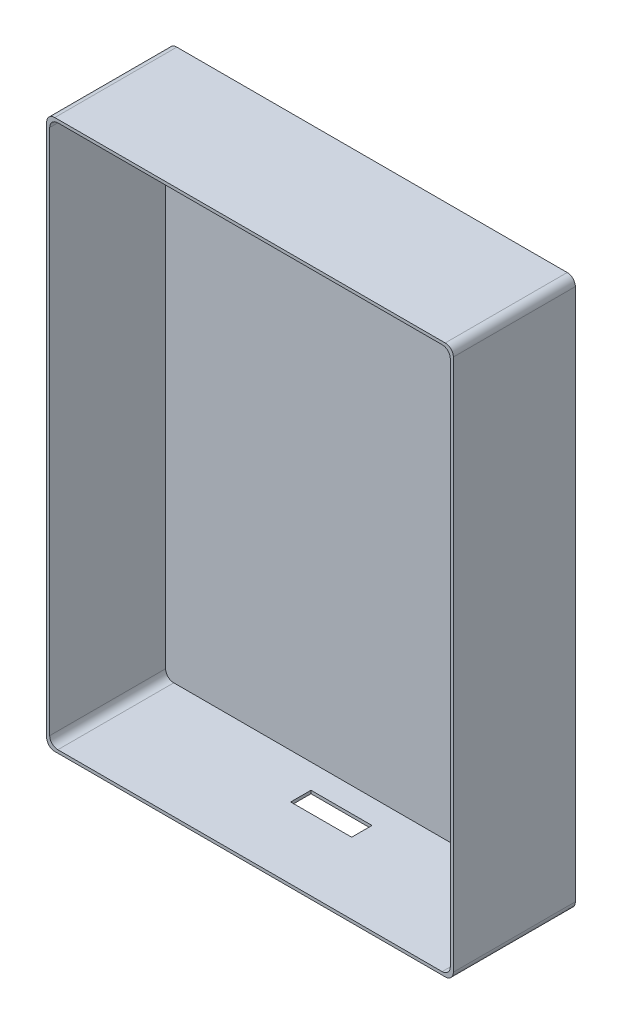
ISO-10303-21;
HEADER;
FILE_DESCRIPTION(('STEP AP214'),'2;1');
FILE_NAME('part.step','',(''),(''),'','','');
FILE_SCHEMA(('AUTOMOTIVE_DESIGN { 1 0 10303 214 1 1 1 1 }'));
ENDSEC;
DATA;
#1=APPLICATION_CONTEXT('core data for automotive mechanical design processes');
#2=APPLICATION_PROTOCOL_DEFINITION('international standard','automotive_design',2000,#1);
#3=PRODUCT_CONTEXT('',#1,'mechanical');
#4=PRODUCT('Part','Part','',(#3));
#5=PRODUCT_RELATED_PRODUCT_CATEGORY('part','',(#4));
#6=PRODUCT_DEFINITION_FORMATION('','',#4);
#7=PRODUCT_DEFINITION_CONTEXT('part definition',#1,'design');
#8=PRODUCT_DEFINITION('design','',#6,#7);
#9=PRODUCT_DEFINITION_SHAPE('','',#8);
#10=(LENGTH_UNIT() NAMED_UNIT(*) SI_UNIT(.MILLI.,.METRE.));
#11=(NAMED_UNIT(*) PLANE_ANGLE_UNIT() SI_UNIT($,.RADIAN.));
#12=(NAMED_UNIT(*) SI_UNIT($,.STERADIAN.) SOLID_ANGLE_UNIT());
#13=UNCERTAINTY_MEASURE_WITH_UNIT(LENGTH_MEASURE(1.E-05),#10,'distance_accuracy_value','');
#14=(GEOMETRIC_REPRESENTATION_CONTEXT(3) GLOBAL_UNCERTAINTY_ASSIGNED_CONTEXT((#13)) GLOBAL_UNIT_ASSIGNED_CONTEXT((#10,
#11,#12)) REPRESENTATION_CONTEXT('',''));
#15=CARTESIAN_POINT('',(0.,0.,0.));
#16=DIRECTION('',(0.,0.,1.));
#17=DIRECTION('',(1.,0.,0.));
#18=AXIS2_PLACEMENT_3D('',#15,#16,#17);
#19=CARTESIAN_POINT('',(-50.,-67.5,30.));
#20=DIRECTION('',(0.,1.,0.));
#21=DIRECTION('',(0.,0.,1.));
#22=AXIS2_PLACEMENT_3D('',#19,#20,#21);
#23=PLANE('',#22);
#24=DIRECTION('',(1.,0.,0.));
#25=VECTOR('',#24,1.);
#26=CARTESIAN_POINT('',(-50.,-67.5,30.));
#27=LINE('',#26,#25);
#28=CARTESIAN_POINT('',(-48.,-67.5,30.));
#29=VERTEX_POINT('',#28);
#30=CARTESIAN_POINT('',(48.,-67.5,30.));
#31=VERTEX_POINT('',#30);
#32=EDGE_CURVE('E229',#29,#31,#27,.T.);
#33=ORIENTED_EDGE('',*,*,#32,.F.);
#34=DIRECTION('',(0.,0.,-1.));
#35=VECTOR('',#34,1.);
#36=CARTESIAN_POINT('',(-48.,-67.5,30.));
#37=LINE('',#36,#35);
#38=CARTESIAN_POINT('',(-48.,-67.5,0.));
#39=VERTEX_POINT('',#38);
#40=EDGE_CURVE('E244',#29,#39,#37,.T.);
#41=ORIENTED_EDGE('',*,*,#40,.T.);
#42=DIRECTION('',(1.,0.,0.));
#43=VECTOR('',#42,1.);
#44=CARTESIAN_POINT('',(-50.,-67.5,0.));
#45=LINE('',#44,#43);
#46=CARTESIAN_POINT('',(48.,-67.5,0.));
#47=VERTEX_POINT('',#46);
#48=EDGE_CURVE('E223',#39,#47,#45,.T.);
#49=ORIENTED_EDGE('',*,*,#48,.T.);
#50=DIRECTION('',(0.,0.,-1.));
#51=VECTOR('',#50,1.);
#52=CARTESIAN_POINT('',(48.,-67.5,30.));
#53=LINE('',#52,#51);
#54=EDGE_CURVE('E232',#47,#31,#53,.F.);
#55=ORIENTED_EDGE('',*,*,#54,.T.);
#56=EDGE_LOOP('',(#33,#41,#49,#55));
#57=FACE_BOUND('',#56,.T.);
#58=DIRECTION('',(0.,0.,-1.));
#59=VECTOR('',#58,1.);
#60=CARTESIAN_POINT('',(7.5,-67.5,0.));
#61=LINE('',#60,#59);
#62=CARTESIAN_POINT('',(7.5,-67.5,12.5));
#63=VERTEX_POINT('',#62);
#64=CARTESIAN_POINT('',(7.5,-67.5,7.5));
#65=VERTEX_POINT('',#64);
#66=EDGE_CURVE('E47',#63,#65,#61,.T.);
#67=ORIENTED_EDGE('',*,*,#66,.T.);
#68=DIRECTION('',(1.,0.,0.));
#69=VECTOR('',#68,1.);
#70=CARTESIAN_POINT('',(0.,-67.5,7.5));
#71=LINE('',#70,#69);
#72=CARTESIAN_POINT('',(-7.49999999999999,-67.5,7.5));
#73=VERTEX_POINT('',#72);
#74=EDGE_CURVE('E185',#73,#65,#71,.T.);
#75=ORIENTED_EDGE('',*,*,#74,.F.);
#76=DIRECTION('',(0.,0.,-1.));
#77=VECTOR('',#76,1.);
#78=CARTESIAN_POINT('',(-7.49999999999999,-67.5,0.));
#79=LINE('',#78,#77);
#80=CARTESIAN_POINT('',(-7.5,-67.5,12.5));
#81=VERTEX_POINT('',#80);
#82=EDGE_CURVE('E171',#81,#73,#79,.T.);
#83=ORIENTED_EDGE('',*,*,#82,.F.);
#84=DIRECTION('',(1.,0.,0.));
#85=VECTOR('',#84,1.);
#86=CARTESIAN_POINT('',(0.,-67.5,12.5));
#87=LINE('',#86,#85);
#88=EDGE_CURVE('E180',#81,#63,#87,.T.);
#89=ORIENTED_EDGE('',*,*,#88,.T.);
#90=EDGE_LOOP('',(#67,#75,#83,#89));
#91=FACE_BOUND('',#90,.T.);
#92=ADVANCED_FACE('F32',(#57,#91),#23,.F.);
#93=CARTESIAN_POINT('',(0.,-66.75,1.5));
#94=DIRECTION('',(0.,-1.,0.));
#95=DIRECTION('',(0.,0.,-1.));
#96=AXIS2_PLACEMENT_3D('',#93,#94,#95);
#97=PLANE('',#96);
#98=DIRECTION('',(1.,0.,0.));
#99=VECTOR('',#98,1.);
#100=CARTESIAN_POINT('',(0.,-66.75,1.5));
#101=LINE('',#100,#99);
#102=CARTESIAN_POINT('',(-47.25,-66.75,1.5));
#103=VERTEX_POINT('',#102);
#104=CARTESIAN_POINT('',(47.25,-66.75,1.5));
#105=VERTEX_POINT('',#104);
#106=EDGE_CURVE('E205',#103,#105,#101,.T.);
#107=ORIENTED_EDGE('',*,*,#106,.F.);
#108=DIRECTION('',(0.,0.,1.));
#109=VECTOR('',#108,1.);
#110=CARTESIAN_POINT('',(-47.25,-66.75,30.));
#111=LINE('',#110,#109);
#112=CARTESIAN_POINT('',(-47.25,-66.75,30.));
#113=VERTEX_POINT('',#112);
#114=EDGE_CURVE('E298',#103,#113,#111,.T.);
#115=ORIENTED_EDGE('',*,*,#114,.T.);
#116=DIRECTION('',(1.,0.,0.));
#117=VECTOR('',#116,1.);
#118=CARTESIAN_POINT('',(0.,-66.75,30.));
#119=LINE('',#118,#117);
#120=CARTESIAN_POINT('',(47.25,-66.75,30.));
#121=VERTEX_POINT('',#120);
#122=EDGE_CURVE('E199',#113,#121,#119,.T.);
#123=ORIENTED_EDGE('',*,*,#122,.T.);
#124=DIRECTION('',(0.,0.,1.));
#125=VECTOR('',#124,1.);
#126=CARTESIAN_POINT('',(47.25,-66.75,1.5));
#127=LINE('',#126,#125);
#128=EDGE_CURVE('E296',#121,#105,#127,.F.);
#129=ORIENTED_EDGE('',*,*,#128,.T.);
#130=EDGE_LOOP('',(#107,#115,#123,#129));
#131=FACE_BOUND('',#130,.T.);
#132=DIRECTION('',(0.,0.,-1.));
#133=VECTOR('',#132,1.);
#134=CARTESIAN_POINT('',(7.5,-66.75,1.5));
#135=LINE('',#134,#133);
#136=CARTESIAN_POINT('',(7.5,-66.75,12.5));
#137=VERTEX_POINT('',#136);
#138=CARTESIAN_POINT('',(7.5,-66.75,7.5));
#139=VERTEX_POINT('',#138);
#140=EDGE_CURVE('E11',#137,#139,#135,.T.);
#141=ORIENTED_EDGE('',*,*,#140,.F.);
#142=DIRECTION('',(1.,0.,0.));
#143=VECTOR('',#142,1.);
#144=CARTESIAN_POINT('',(0.,-66.75,12.5));
#145=LINE('',#144,#143);
#146=CARTESIAN_POINT('',(-7.5,-66.75,12.5));
#147=VERTEX_POINT('',#146);
#148=EDGE_CURVE('E314',#147,#137,#145,.T.);
#149=ORIENTED_EDGE('',*,*,#148,.F.);
#150=DIRECTION('',(0.,0.,-1.));
#151=VECTOR('',#150,1.);
#152=CARTESIAN_POINT('',(-7.49999999999999,-66.75,1.5));
#153=LINE('',#152,#151);
#154=CARTESIAN_POINT('',(-7.49999999999999,-66.75,7.5));
#155=VERTEX_POINT('',#154);
#156=EDGE_CURVE('E174',#147,#155,#153,.T.);
#157=ORIENTED_EDGE('',*,*,#156,.T.);
#158=DIRECTION('',(1.,0.,0.));
#159=VECTOR('',#158,1.);
#160=CARTESIAN_POINT('',(0.,-66.75,7.5));
#161=LINE('',#160,#159);
#162=EDGE_CURVE('E40',#155,#139,#161,.T.);
#163=ORIENTED_EDGE('',*,*,#162,.T.);
#164=EDGE_LOOP('',(#141,#149,#157,#163));
#165=FACE_BOUND('',#164,.T.);
#166=ADVANCED_FACE('F319',(#131,#165),#97,.F.);
#167=CARTESIAN_POINT('',(0.,0.,30.));
#168=DIRECTION('',(0.,0.,1.));
#169=DIRECTION('',(1.,0.,0.));
#170=AXIS2_PLACEMENT_3D('',#167,#168,#169);
#171=PLANE('',#170);
#172=DIRECTION('',(0.,-1.,0.));
#173=VECTOR('',#172,1.);
#174=CARTESIAN_POINT('',(-50.,67.5,30.));
#175=LINE('',#174,#173);
#176=CARTESIAN_POINT('',(-50.,65.5,30.));
#177=VERTEX_POINT('',#176);
#178=CARTESIAN_POINT('',(-50.,-65.5,30.));
#179=VERTEX_POINT('',#178);
#180=EDGE_CURVE('E226',#177,#179,#175,.T.);
#181=ORIENTED_EDGE('',*,*,#180,.T.);
#182=CARTESIAN_POINT('',(-48.,-65.5,30.));
#183=DIRECTION('',(0.,0.,1.));
#184=DIRECTION('',(1.,0.,0.));
#185=AXIS2_PLACEMENT_3D('',#182,#183,#184);
#186=CIRCLE('',#185,2.);
#187=EDGE_CURVE('E266',#179,#29,#186,.T.);
#188=ORIENTED_EDGE('',*,*,#187,.T.);
#189=ORIENTED_EDGE('',*,*,#32,.T.);
#190=CARTESIAN_POINT('',(48.,-65.5,30.));
#191=DIRECTION('',(0.,0.,1.));
#192=DIRECTION('',(1.,0.,0.));
#193=AXIS2_PLACEMENT_3D('',#190,#191,#192);
#194=CIRCLE('',#193,2.);
#195=CARTESIAN_POINT('',(50.,-65.5,30.));
#196=VERTEX_POINT('',#195);
#197=EDGE_CURVE('E260',#31,#196,#194,.T.);
#198=ORIENTED_EDGE('',*,*,#197,.T.);
#199=DIRECTION('',(0.,1.,0.));
#200=VECTOR('',#199,1.);
#201=CARTESIAN_POINT('',(50.,67.5,30.));
#202=LINE('',#201,#200);
#203=CARTESIAN_POINT('',(50.,65.5,30.));
#204=VERTEX_POINT('',#203);
#205=EDGE_CURVE('E219',#196,#204,#202,.T.);
#206=ORIENTED_EDGE('',*,*,#205,.T.);
#207=CARTESIAN_POINT('',(48.,65.5,30.));
#208=DIRECTION('',(0.,0.,1.));
#209=DIRECTION('',(1.,0.,0.));
#210=AXIS2_PLACEMENT_3D('',#207,#208,#209);
#211=CIRCLE('',#210,2.);
#212=CARTESIAN_POINT('',(48.,67.5,30.));
#213=VERTEX_POINT('',#212);
#214=EDGE_CURVE('E262',#204,#213,#211,.T.);
#215=ORIENTED_EDGE('',*,*,#214,.T.);
#216=DIRECTION('',(-1.,0.,0.));
#217=VECTOR('',#216,1.);
#218=CARTESIAN_POINT('',(-50.,67.5,30.));
#219=LINE('',#218,#217);
#220=CARTESIAN_POINT('',(-48.,67.5,30.));
#221=VERTEX_POINT('',#220);
#222=EDGE_CURVE('E222',#213,#221,#219,.T.);
#223=ORIENTED_EDGE('',*,*,#222,.T.);
#224=CARTESIAN_POINT('',(-48.,65.5,30.));
#225=DIRECTION('',(0.,0.,1.));
#226=DIRECTION('',(1.,0.,0.));
#227=AXIS2_PLACEMENT_3D('',#224,#225,#226);
#228=CIRCLE('',#227,2.);
#229=EDGE_CURVE('E264',#221,#177,#228,.T.);
#230=ORIENTED_EDGE('',*,*,#229,.T.);
#231=EDGE_LOOP('',(#181,#188,#189,#198,#206,#215,#223,#230));
#232=FACE_BOUND('',#231,.T.);
#233=DIRECTION('',(0.,-1.,0.));
#234=VECTOR('',#233,1.);
#235=CARTESIAN_POINT('',(-49.25,0.,30.));
#236=LINE('',#235,#234);
#237=CARTESIAN_POINT('',(-49.25,64.75,30.));
#238=VERTEX_POINT('',#237);
#239=CARTESIAN_POINT('',(-49.25,-64.75,30.));
#240=VERTEX_POINT('',#239);
#241=EDGE_CURVE('E214',#238,#240,#236,.T.);
#242=ORIENTED_EDGE('',*,*,#241,.F.);
#243=CARTESIAN_POINT('',(-47.25,64.75,30.));
#244=DIRECTION('',(0.,0.,1.));
#245=DIRECTION('',(1.,0.,0.));
#246=AXIS2_PLACEMENT_3D('',#243,#244,#245);
#247=CIRCLE('',#246,2.);
#248=CARTESIAN_POINT('',(-47.25,66.75,30.));
#249=VERTEX_POINT('',#248);
#250=EDGE_CURVE('E306',#238,#249,#247,.F.);
#251=ORIENTED_EDGE('',*,*,#250,.T.);
#252=DIRECTION('',(1.,0.,0.));
#253=VECTOR('',#252,1.);
#254=CARTESIAN_POINT('',(0.,66.75,30.));
#255=LINE('',#254,#253);
#256=CARTESIAN_POINT('',(47.25,66.75,30.));
#257=VERTEX_POINT('',#256);
#258=EDGE_CURVE('E211',#249,#257,#255,.T.);
#259=ORIENTED_EDGE('',*,*,#258,.T.);
#260=CARTESIAN_POINT('',(47.25,64.75,30.));
#261=DIRECTION('',(0.,0.,1.));
#262=DIRECTION('',(1.,0.,0.));
#263=AXIS2_PLACEMENT_3D('',#260,#261,#262);
#264=CIRCLE('',#263,2.);
#265=CARTESIAN_POINT('',(49.25,64.75,30.));
#266=VERTEX_POINT('',#265);
#267=EDGE_CURVE('E312',#257,#266,#264,.F.);
#268=ORIENTED_EDGE('',*,*,#267,.T.);
#269=DIRECTION('',(0.,-1.,0.));
#270=VECTOR('',#269,1.);
#271=CARTESIAN_POINT('',(49.25,0.,30.));
#272=LINE('',#271,#270);
#273=CARTESIAN_POINT('',(49.25,-64.75,30.));
#274=VERTEX_POINT('',#273);
#275=EDGE_CURVE('E192',#266,#274,#272,.T.);
#276=ORIENTED_EDGE('',*,*,#275,.T.);
#277=CARTESIAN_POINT('',(47.25,-64.75,30.));
#278=DIRECTION('',(0.,0.,1.));
#279=DIRECTION('',(1.,0.,0.));
#280=AXIS2_PLACEMENT_3D('',#277,#278,#279);
#281=CIRCLE('',#280,2.);
#282=EDGE_CURVE('E310',#274,#121,#281,.F.);
#283=ORIENTED_EDGE('',*,*,#282,.T.);
#284=ORIENTED_EDGE('',*,*,#122,.F.);
#285=CARTESIAN_POINT('',(-47.25,-64.75,30.));
#286=DIRECTION('',(0.,0.,1.));
#287=DIRECTION('',(1.,0.,0.));
#288=AXIS2_PLACEMENT_3D('',#285,#286,#287);
#289=CIRCLE('',#288,2.);
#290=EDGE_CURVE('E308',#113,#240,#289,.F.);
#291=ORIENTED_EDGE('',*,*,#290,.T.);
#292=EDGE_LOOP('',(#242,#251,#259,#268,#276,#283,#284,#291));
#293=FACE_BOUND('',#292,.T.);
#294=ADVANCED_FACE('F343',(#232,#293),#171,.T.);
#295=CARTESIAN_POINT('',(50.,67.5,30.));
#296=DIRECTION('',(-1.,0.,0.));
#297=DIRECTION('',(0.,0.,1.));
#298=AXIS2_PLACEMENT_3D('',#295,#296,#297);
#299=PLANE('',#298);
#300=DIRECTION('',(0.,1.,0.));
#301=VECTOR('',#300,1.);
#302=CARTESIAN_POINT('',(50.,67.5,0.));
#303=LINE('',#302,#301);
#304=CARTESIAN_POINT('',(50.,-65.5,0.));
#305=VERTEX_POINT('',#304);
#306=CARTESIAN_POINT('',(50.,65.5,0.));
#307=VERTEX_POINT('',#306);
#308=EDGE_CURVE('E208',#305,#307,#303,.T.);
#309=ORIENTED_EDGE('',*,*,#308,.T.);
#310=DIRECTION('',(0.,0.,-1.));
#311=VECTOR('',#310,1.);
#312=CARTESIAN_POINT('',(50.,65.5,30.));
#313=LINE('',#312,#311);
#314=EDGE_CURVE('E276',#307,#204,#313,.F.);
#315=ORIENTED_EDGE('',*,*,#314,.T.);
#316=ORIENTED_EDGE('',*,*,#205,.F.);
#317=DIRECTION('',(0.,0.,-1.));
#318=VECTOR('',#317,1.);
#319=CARTESIAN_POINT('',(50.,-65.5,30.));
#320=LINE('',#319,#318);
#321=EDGE_CURVE('E273',#196,#305,#320,.T.);
#322=ORIENTED_EDGE('',*,*,#321,.T.);
#323=EDGE_LOOP('',(#309,#315,#316,#322));
#324=FACE_BOUND('',#323,.T.);
#325=ADVANCED_FACE('F358',(#324),#299,.F.);
#326=CARTESIAN_POINT('',(-50.,67.5,30.));
#327=DIRECTION('',(0.,-1.,0.));
#328=DIRECTION('',(0.,0.,-1.));
#329=AXIS2_PLACEMENT_3D('',#326,#327,#328);
#330=PLANE('',#329);
#331=DIRECTION('',(-1.,0.,0.));
#332=VECTOR('',#331,1.);
#333=CARTESIAN_POINT('',(-50.,67.5,0.));
#334=LINE('',#333,#332);
#335=CARTESIAN_POINT('',(48.,67.5,0.));
#336=VERTEX_POINT('',#335);
#337=CARTESIAN_POINT('',(-48.,67.5,0.));
#338=VERTEX_POINT('',#337);
#339=EDGE_CURVE('E235',#336,#338,#334,.T.);
#340=ORIENTED_EDGE('',*,*,#339,.T.);
#341=DIRECTION('',(0.,0.,-1.));
#342=VECTOR('',#341,1.);
#343=CARTESIAN_POINT('',(-48.,67.5,30.));
#344=LINE('',#343,#342);
#345=EDGE_CURVE('E271',#338,#221,#344,.F.);
#346=ORIENTED_EDGE('',*,*,#345,.T.);
#347=ORIENTED_EDGE('',*,*,#222,.F.);
#348=DIRECTION('',(0.,0.,-1.));
#349=VECTOR('',#348,1.);
#350=CARTESIAN_POINT('',(48.,67.5,30.));
#351=LINE('',#350,#349);
#352=EDGE_CURVE('E268',#213,#336,#351,.T.);
#353=ORIENTED_EDGE('',*,*,#352,.T.);
#354=EDGE_LOOP('',(#340,#346,#347,#353));
#355=FACE_BOUND('',#354,.T.);
#356=ADVANCED_FACE('F354',(#355),#330,.F.);
#357=CARTESIAN_POINT('',(-50.,67.5,30.));
#358=DIRECTION('',(1.,0.,0.));
#359=DIRECTION('',(0.,1.,0.));
#360=AXIS2_PLACEMENT_3D('',#357,#358,#359);
#361=PLANE('',#360);
#362=DIRECTION('',(0.,-1.,0.));
#363=VECTOR('',#362,1.);
#364=CARTESIAN_POINT('',(-50.,67.5,0.));
#365=LINE('',#364,#363);
#366=CARTESIAN_POINT('',(-50.,65.5,0.));
#367=VERTEX_POINT('',#366);
#368=CARTESIAN_POINT('',(-50.,-65.5,0.));
#369=VERTEX_POINT('',#368);
#370=EDGE_CURVE('E238',#367,#369,#365,.T.);
#371=ORIENTED_EDGE('',*,*,#370,.T.);
#372=DIRECTION('',(0.,0.,-1.));
#373=VECTOR('',#372,1.);
#374=CARTESIAN_POINT('',(-50.,-65.5,30.));
#375=LINE('',#374,#373);
#376=EDGE_CURVE('E258',#369,#179,#375,.F.);
#377=ORIENTED_EDGE('',*,*,#376,.T.);
#378=ORIENTED_EDGE('',*,*,#180,.F.);
#379=DIRECTION('',(0.,0.,-1.));
#380=VECTOR('',#379,1.);
#381=CARTESIAN_POINT('',(-50.,65.5,30.));
#382=LINE('',#381,#380);
#383=EDGE_CURVE('E255',#177,#367,#382,.T.);
#384=ORIENTED_EDGE('',*,*,#383,.T.);
#385=EDGE_LOOP('',(#371,#377,#378,#384));
#386=FACE_BOUND('',#385,.T.);
#387=ADVANCED_FACE('F351',(#386),#361,.F.);
#388=CARTESIAN_POINT('',(0.,0.,0.));
#389=DIRECTION('',(0.,0.,1.));
#390=DIRECTION('',(1.,0.,0.));
#391=AXIS2_PLACEMENT_3D('',#388,#389,#390);
#392=PLANE('',#391);
#393=ORIENTED_EDGE('',*,*,#48,.F.);
#394=CARTESIAN_POINT('',(-48.,-65.5,0.));
#395=DIRECTION('',(0.,0.,1.));
#396=DIRECTION('',(1.,0.,0.));
#397=AXIS2_PLACEMENT_3D('',#394,#395,#396);
#398=CIRCLE('',#397,2.);
#399=EDGE_CURVE('E253',#39,#369,#398,.F.);
#400=ORIENTED_EDGE('',*,*,#399,.T.);
#401=ORIENTED_EDGE('',*,*,#370,.F.);
#402=CARTESIAN_POINT('',(-48.,65.5,0.));
#403=DIRECTION('',(0.,0.,1.));
#404=DIRECTION('',(1.,0.,0.));
#405=AXIS2_PLACEMENT_3D('',#402,#403,#404);
#406=CIRCLE('',#405,2.);
#407=EDGE_CURVE('E251',#367,#338,#406,.F.);
#408=ORIENTED_EDGE('',*,*,#407,.T.);
#409=ORIENTED_EDGE('',*,*,#339,.F.);
#410=CARTESIAN_POINT('',(48.,65.5,0.));
#411=DIRECTION('',(0.,0.,1.));
#412=DIRECTION('',(1.,0.,0.));
#413=AXIS2_PLACEMENT_3D('',#410,#411,#412);
#414=CIRCLE('',#413,2.);
#415=EDGE_CURVE('E249',#336,#307,#414,.F.);
#416=ORIENTED_EDGE('',*,*,#415,.T.);
#417=ORIENTED_EDGE('',*,*,#308,.F.);
#418=CARTESIAN_POINT('',(48.,-65.5,0.));
#419=DIRECTION('',(0.,0.,1.));
#420=DIRECTION('',(1.,0.,0.));
#421=AXIS2_PLACEMENT_3D('',#418,#419,#420);
#422=CIRCLE('',#421,2.);
#423=EDGE_CURVE('E247',#305,#47,#422,.F.);
#424=ORIENTED_EDGE('',*,*,#423,.T.);
#425=EDGE_LOOP('',(#393,#400,#401,#408,#409,#416,#417,#424));
#426=FACE_BOUND('',#425,.T.);
#427=ADVANCED_FACE('F349',(#426),#392,.F.);
#428=CARTESIAN_POINT('',(49.25,0.,1.5));
#429=DIRECTION('',(-1.,0.,0.));
#430=DIRECTION('',(0.,0.,1.));
#431=AXIS2_PLACEMENT_3D('',#428,#429,#430);
#432=PLANE('',#431);
#433=DIRECTION('',(0.,-1.,0.));
#434=VECTOR('',#433,1.);
#435=CARTESIAN_POINT('',(49.25,0.,1.5));
#436=LINE('',#435,#434);
#437=CARTESIAN_POINT('',(49.25,64.75,1.5));
#438=VERTEX_POINT('',#437);
#439=CARTESIAN_POINT('',(49.25,-64.75,1.5));
#440=VERTEX_POINT('',#439);
#441=EDGE_CURVE('E195',#438,#440,#436,.T.);
#442=ORIENTED_EDGE('',*,*,#441,.T.);
#443=DIRECTION('',(0.,0.,1.));
#444=VECTOR('',#443,1.);
#445=CARTESIAN_POINT('',(49.25,-64.75,1.5));
#446=LINE('',#445,#444);
#447=EDGE_CURVE('E303',#440,#274,#446,.T.);
#448=ORIENTED_EDGE('',*,*,#447,.T.);
#449=ORIENTED_EDGE('',*,*,#275,.F.);
#450=DIRECTION('',(0.,0.,1.));
#451=VECTOR('',#450,1.);
#452=CARTESIAN_POINT('',(49.25,64.75,1.5));
#453=LINE('',#452,#451);
#454=EDGE_CURVE('E301',#266,#438,#453,.F.);
#455=ORIENTED_EDGE('',*,*,#454,.T.);
#456=EDGE_LOOP('',(#442,#448,#449,#455));
#457=FACE_BOUND('',#456,.T.);
#458=ADVANCED_FACE('F400',(#457),#432,.T.);
#459=CARTESIAN_POINT('',(-49.25,0.,1.5));
#460=DIRECTION('',(-1.,0.,0.));
#461=DIRECTION('',(0.,0.,1.));
#462=AXIS2_PLACEMENT_3D('',#459,#460,#461);
#463=PLANE('',#462);
#464=DIRECTION('',(0.,-1.,0.));
#465=VECTOR('',#464,1.);
#466=CARTESIAN_POINT('',(-49.25,0.,1.5));
#467=LINE('',#466,#465);
#468=CARTESIAN_POINT('',(-49.25,64.75,1.5));
#469=VERTEX_POINT('',#468);
#470=CARTESIAN_POINT('',(-49.25,-64.75,1.5));
#471=VERTEX_POINT('',#470);
#472=EDGE_CURVE('E202',#469,#471,#467,.T.);
#473=ORIENTED_EDGE('',*,*,#472,.F.);
#474=DIRECTION('',(0.,0.,1.));
#475=VECTOR('',#474,1.);
#476=CARTESIAN_POINT('',(-49.25,64.75,1.5));
#477=LINE('',#476,#475);
#478=EDGE_CURVE('E280',#469,#238,#477,.T.);
#479=ORIENTED_EDGE('',*,*,#478,.T.);
#480=ORIENTED_EDGE('',*,*,#241,.T.);
#481=DIRECTION('',(0.,0.,1.));
#482=VECTOR('',#481,1.);
#483=CARTESIAN_POINT('',(-49.25,-64.75,1.5));
#484=LINE('',#483,#482);
#485=EDGE_CURVE('E278',#240,#471,#484,.F.);
#486=ORIENTED_EDGE('',*,*,#485,.T.);
#487=EDGE_LOOP('',(#473,#479,#480,#486));
#488=FACE_BOUND('',#487,.T.);
#489=ADVANCED_FACE('F413',(#488),#463,.F.);
#490=CARTESIAN_POINT('',(0.,66.75,1.5));
#491=DIRECTION('',(0.,-1.,0.));
#492=DIRECTION('',(0.,0.,-1.));
#493=AXIS2_PLACEMENT_3D('',#490,#491,#492);
#494=PLANE('',#493);
#495=ORIENTED_EDGE('',*,*,#258,.F.);
#496=DIRECTION('',(0.,0.,1.));
#497=VECTOR('',#496,1.);
#498=CARTESIAN_POINT('',(-47.25,66.75,1.5));
#499=LINE('',#498,#497);
#500=CARTESIAN_POINT('',(-47.25,66.75,1.5));
#501=VERTEX_POINT('',#500);
#502=EDGE_CURVE('E286',#249,#501,#499,.F.);
#503=ORIENTED_EDGE('',*,*,#502,.T.);
#504=DIRECTION('',(1.,0.,0.));
#505=VECTOR('',#504,1.);
#506=CARTESIAN_POINT('',(0.,66.75,1.5));
#507=LINE('',#506,#505);
#508=CARTESIAN_POINT('',(47.25,66.75,1.5));
#509=VERTEX_POINT('',#508);
#510=EDGE_CURVE('E198',#501,#509,#507,.T.);
#511=ORIENTED_EDGE('',*,*,#510,.T.);
#512=DIRECTION('',(0.,0.,1.));
#513=VECTOR('',#512,1.);
#514=CARTESIAN_POINT('',(47.25,66.75,30.));
#515=LINE('',#514,#513);
#516=EDGE_CURVE('E283',#509,#257,#515,.T.);
#517=ORIENTED_EDGE('',*,*,#516,.T.);
#518=EDGE_LOOP('',(#495,#503,#511,#517));
#519=FACE_BOUND('',#518,.T.);
#520=ADVANCED_FACE('F407',(#519),#494,.T.);
#521=CARTESIAN_POINT('',(0.,0.,1.5));
#522=DIRECTION('',(0.,0.,1.));
#523=DIRECTION('',(1.,0.,0.));
#524=AXIS2_PLACEMENT_3D('',#521,#522,#523);
#525=PLANE('',#524);
#526=ORIENTED_EDGE('',*,*,#510,.F.);
#527=CARTESIAN_POINT('',(-47.25,64.75,1.5));
#528=DIRECTION('',(0.,0.,1.));
#529=DIRECTION('',(1.,0.,0.));
#530=AXIS2_PLACEMENT_3D('',#527,#528,#529);
#531=CIRCLE('',#530,2.);
#532=EDGE_CURVE('E294',#501,#469,#531,.T.);
#533=ORIENTED_EDGE('',*,*,#532,.T.);
#534=ORIENTED_EDGE('',*,*,#472,.T.);
#535=CARTESIAN_POINT('',(-47.25,-64.75,1.5));
#536=DIRECTION('',(0.,0.,1.));
#537=DIRECTION('',(1.,0.,0.));
#538=AXIS2_PLACEMENT_3D('',#535,#536,#537);
#539=CIRCLE('',#538,2.);
#540=EDGE_CURVE('E292',#471,#103,#539,.T.);
#541=ORIENTED_EDGE('',*,*,#540,.T.);
#542=ORIENTED_EDGE('',*,*,#106,.T.);
#543=CARTESIAN_POINT('',(47.25,-64.75,1.5));
#544=DIRECTION('',(0.,0.,1.));
#545=DIRECTION('',(1.,0.,0.));
#546=AXIS2_PLACEMENT_3D('',#543,#544,#545);
#547=CIRCLE('',#546,2.);
#548=EDGE_CURVE('E290',#105,#440,#547,.T.);
#549=ORIENTED_EDGE('',*,*,#548,.T.);
#550=ORIENTED_EDGE('',*,*,#441,.F.);
#551=CARTESIAN_POINT('',(47.25,64.75,1.5));
#552=DIRECTION('',(0.,0.,1.));
#553=DIRECTION('',(1.,0.,0.));
#554=AXIS2_PLACEMENT_3D('',#551,#552,#553);
#555=CIRCLE('',#554,2.);
#556=EDGE_CURVE('E288',#438,#509,#555,.T.);
#557=ORIENTED_EDGE('',*,*,#556,.T.);
#558=EDGE_LOOP('',(#526,#533,#534,#541,#542,#549,#550,#557));
#559=FACE_BOUND('',#558,.T.);
#560=ADVANCED_FACE('F367',(#559),#525,.T.);
#561=CARTESIAN_POINT('',(-48.,-65.5,30.));
#562=DIRECTION('',(0.,0.,-1.));
#563=DIRECTION('',(-1.,0.,0.));
#564=AXIS2_PLACEMENT_3D('',#561,#562,#563);
#565=CYLINDRICAL_SURFACE('',#564,2.);
#566=ORIENTED_EDGE('',*,*,#187,.F.);
#567=ORIENTED_EDGE('',*,*,#376,.F.);
#568=ORIENTED_EDGE('',*,*,#399,.F.);
#569=ORIENTED_EDGE('',*,*,#40,.F.);
#570=EDGE_LOOP('',(#566,#567,#568,#569));
#571=FACE_BOUND('',#570,.T.);
#572=ADVANCED_FACE('F363',(#571),#565,.T.);
#573=CARTESIAN_POINT('',(-48.,65.5,30.));
#574=DIRECTION('',(0.,0.,-1.));
#575=DIRECTION('',(-1.,0.,0.));
#576=AXIS2_PLACEMENT_3D('',#573,#574,#575);
#577=CYLINDRICAL_SURFACE('',#576,2.);
#578=ORIENTED_EDGE('',*,*,#229,.F.);
#579=ORIENTED_EDGE('',*,*,#345,.F.);
#580=ORIENTED_EDGE('',*,*,#407,.F.);
#581=ORIENTED_EDGE('',*,*,#383,.F.);
#582=EDGE_LOOP('',(#578,#579,#580,#581));
#583=FACE_BOUND('',#582,.T.);
#584=ADVANCED_FACE('F366',(#583),#577,.T.);
#585=CARTESIAN_POINT('',(48.,65.5,30.));
#586=DIRECTION('',(0.,0.,-1.));
#587=DIRECTION('',(-1.,0.,0.));
#588=AXIS2_PLACEMENT_3D('',#585,#586,#587);
#589=CYLINDRICAL_SURFACE('',#588,2.);
#590=ORIENTED_EDGE('',*,*,#214,.F.);
#591=ORIENTED_EDGE('',*,*,#314,.F.);
#592=ORIENTED_EDGE('',*,*,#415,.F.);
#593=ORIENTED_EDGE('',*,*,#352,.F.);
#594=EDGE_LOOP('',(#590,#591,#592,#593));
#595=FACE_BOUND('',#594,.T.);
#596=ADVANCED_FACE('F371',(#595),#589,.T.);
#597=CARTESIAN_POINT('',(48.,-65.5,30.));
#598=DIRECTION('',(0.,0.,-1.));
#599=DIRECTION('',(-1.,0.,0.));
#600=AXIS2_PLACEMENT_3D('',#597,#598,#599);
#601=CYLINDRICAL_SURFACE('',#600,2.);
#602=ORIENTED_EDGE('',*,*,#197,.F.);
#603=ORIENTED_EDGE('',*,*,#54,.F.);
#604=ORIENTED_EDGE('',*,*,#423,.F.);
#605=ORIENTED_EDGE('',*,*,#321,.F.);
#606=EDGE_LOOP('',(#602,#603,#604,#605));
#607=FACE_BOUND('',#606,.T.);
#608=ADVANCED_FACE('F375',(#607),#601,.T.);
#609=CARTESIAN_POINT('',(-47.25,64.75,1.5));
#610=DIRECTION('',(0.,0.,1.));
#611=DIRECTION('',(1.,0.,0.));
#612=AXIS2_PLACEMENT_3D('',#609,#610,#611);
#613=CYLINDRICAL_SURFACE('',#612,2.);
#614=ORIENTED_EDGE('',*,*,#532,.F.);
#615=ORIENTED_EDGE('',*,*,#502,.F.);
#616=ORIENTED_EDGE('',*,*,#250,.F.);
#617=ORIENTED_EDGE('',*,*,#478,.F.);
#618=EDGE_LOOP('',(#614,#615,#616,#617));
#619=FACE_BOUND('',#618,.T.);
#620=ADVANCED_FACE('F379',(#619),#613,.F.);
#621=CARTESIAN_POINT('',(-47.25,-64.75,1.5));
#622=DIRECTION('',(0.,0.,-1.));
#623=DIRECTION('',(-1.,0.,0.));
#624=AXIS2_PLACEMENT_3D('',#621,#622,#623);
#625=CYLINDRICAL_SURFACE('',#624,2.);
#626=ORIENTED_EDGE('',*,*,#540,.F.);
#627=ORIENTED_EDGE('',*,*,#485,.F.);
#628=ORIENTED_EDGE('',*,*,#290,.F.);
#629=ORIENTED_EDGE('',*,*,#114,.F.);
#630=EDGE_LOOP('',(#626,#627,#628,#629));
#631=FACE_BOUND('',#630,.T.);
#632=ADVANCED_FACE('F383',(#631),#625,.F.);
#633=CARTESIAN_POINT('',(47.25,-64.75,1.5));
#634=DIRECTION('',(0.,0.,1.));
#635=DIRECTION('',(1.,0.,0.));
#636=AXIS2_PLACEMENT_3D('',#633,#634,#635);
#637=CYLINDRICAL_SURFACE('',#636,2.);
#638=ORIENTED_EDGE('',*,*,#548,.F.);
#639=ORIENTED_EDGE('',*,*,#128,.F.);
#640=ORIENTED_EDGE('',*,*,#282,.F.);
#641=ORIENTED_EDGE('',*,*,#447,.F.);
#642=EDGE_LOOP('',(#638,#639,#640,#641));
#643=FACE_BOUND('',#642,.T.);
#644=ADVANCED_FACE('F332',(#643),#637,.F.);
#645=CARTESIAN_POINT('',(47.25,64.75,1.5));
#646=DIRECTION('',(0.,0.,-1.));
#647=DIRECTION('',(-1.,0.,0.));
#648=AXIS2_PLACEMENT_3D('',#645,#646,#647);
#649=CYLINDRICAL_SURFACE('',#648,2.);
#650=ORIENTED_EDGE('',*,*,#556,.F.);
#651=ORIENTED_EDGE('',*,*,#454,.F.);
#652=ORIENTED_EDGE('',*,*,#267,.F.);
#653=ORIENTED_EDGE('',*,*,#516,.F.);
#654=EDGE_LOOP('',(#650,#651,#652,#653));
#655=FACE_BOUND('',#654,.T.);
#656=ADVANCED_FACE('F34',(#655),#649,.F.);
#657=CARTESIAN_POINT('',(7.5,-66.,0.));
#658=DIRECTION('',(-1.,0.,0.));
#659=DIRECTION('',(0.,0.,1.));
#660=AXIS2_PLACEMENT_3D('',#657,#658,#659);
#661=PLANE('',#660);
#662=ORIENTED_EDGE('',*,*,#140,.T.);
#663=DIRECTION('',(0.,-1.,0.));
#664=VECTOR('',#663,1.);
#665=CARTESIAN_POINT('',(7.5,-66.,7.5));
#666=LINE('',#665,#664);
#667=EDGE_CURVE('E190',#139,#65,#666,.T.);
#668=ORIENTED_EDGE('',*,*,#667,.T.);
#669=ORIENTED_EDGE('',*,*,#66,.F.);
#670=DIRECTION('',(0.,-1.,0.));
#671=VECTOR('',#670,1.);
#672=CARTESIAN_POINT('',(7.5,-66.,12.5));
#673=LINE('',#672,#671);
#674=EDGE_CURVE('E177',#137,#63,#673,.T.);
#675=ORIENTED_EDGE('',*,*,#674,.F.);
#676=EDGE_LOOP('',(#662,#668,#669,#675));
#677=FACE_BOUND('',#676,.T.);
#678=ADVANCED_FACE('F323',(#677),#661,.T.);
#679=CARTESIAN_POINT('',(0.,-66.,7.5));
#680=DIRECTION('',(0.,0.,-1.));
#681=DIRECTION('',(-1.,0.,0.));
#682=AXIS2_PLACEMENT_3D('',#679,#680,#681);
#683=PLANE('',#682);
#684=DIRECTION('',(0.,-1.,0.));
#685=VECTOR('',#684,1.);
#686=CARTESIAN_POINT('',(-7.49999999999999,-66.,7.5));
#687=LINE('',#686,#685);
#688=EDGE_CURVE('E176',#155,#73,#687,.T.);
#689=ORIENTED_EDGE('',*,*,#688,.T.);
#690=ORIENTED_EDGE('',*,*,#74,.T.);
#691=ORIENTED_EDGE('',*,*,#667,.F.);
#692=ORIENTED_EDGE('',*,*,#162,.F.);
#693=EDGE_LOOP('',(#689,#690,#691,#692));
#694=FACE_BOUND('',#693,.T.);
#695=ADVANCED_FACE('F322',(#694),#683,.F.);
#696=CARTESIAN_POINT('',(-7.49999999999999,-66.,0.));
#697=DIRECTION('',(-1.,0.,0.));
#698=DIRECTION('',(0.,0.,1.));
#699=AXIS2_PLACEMENT_3D('',#696,#697,#698);
#700=PLANE('',#699);
#701=DIRECTION('',(0.,-1.,0.));
#702=VECTOR('',#701,1.);
#703=CARTESIAN_POINT('',(-7.5,-66.,12.5));
#704=LINE('',#703,#702);
#705=EDGE_CURVE('E55',#147,#81,#704,.T.);
#706=ORIENTED_EDGE('',*,*,#705,.T.);
#707=ORIENTED_EDGE('',*,*,#82,.T.);
#708=ORIENTED_EDGE('',*,*,#688,.F.);
#709=ORIENTED_EDGE('',*,*,#156,.F.);
#710=EDGE_LOOP('',(#706,#707,#708,#709));
#711=FACE_BOUND('',#710,.T.);
#712=ADVANCED_FACE('F168',(#711),#700,.F.);
#713=CARTESIAN_POINT('',(0.,-66.,12.5));
#714=DIRECTION('',(0.,0.,-1.));
#715=DIRECTION('',(-1.,0.,0.));
#716=AXIS2_PLACEMENT_3D('',#713,#714,#715);
#717=PLANE('',#716);
#718=ORIENTED_EDGE('',*,*,#148,.T.);
#719=ORIENTED_EDGE('',*,*,#674,.T.);
#720=ORIENTED_EDGE('',*,*,#88,.F.);
#721=ORIENTED_EDGE('',*,*,#705,.F.);
#722=EDGE_LOOP('',(#718,#719,#720,#721));
#723=FACE_BOUND('',#722,.T.);
#724=ADVANCED_FACE('F181',(#723),#717,.T.);
#725=CLOSED_SHELL('',(#92,#166,#294,#325,#356,#387,#427,#458,#489,#520,#560,#572,#584,#596,#608,
#620,#632,#644,#656,#678,#695,#712,#724));
#726=MANIFOLD_SOLID_BREP('B2',#725);
#727=ADVANCED_BREP_SHAPE_REPRESENTATION('',(#18,#726),#14);
#728=SHAPE_DEFINITION_REPRESENTATION(#9,#727);
ENDSEC;
END-ISO-10303-21;
